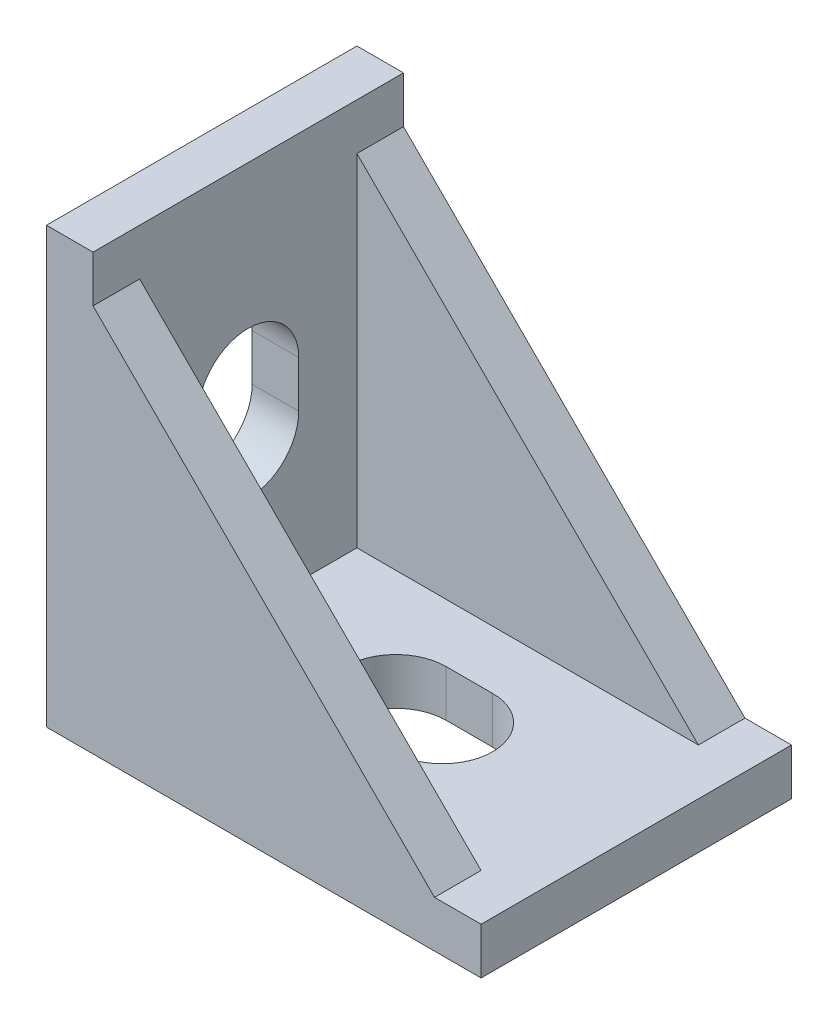
ISO-10303-21;
HEADER;
FILE_DESCRIPTION(('STEP AP214'),'2;1');
FILE_NAME('part.step','',(''),(''),'','','');
FILE_SCHEMA(('AUTOMOTIVE_DESIGN { 1 0 10303 214 1 1 1 1 }'));
ENDSEC;
DATA;
#1=APPLICATION_CONTEXT('core data for automotive mechanical design processes');
#2=APPLICATION_PROTOCOL_DEFINITION('international standard','automotive_design',2000,#1);
#3=PRODUCT_CONTEXT('',#1,'mechanical');
#4=PRODUCT('Part','Part','',(#3));
#5=PRODUCT_RELATED_PRODUCT_CATEGORY('part','',(#4));
#6=PRODUCT_DEFINITION_FORMATION('','',#4);
#7=PRODUCT_DEFINITION_CONTEXT('part definition',#1,'design');
#8=PRODUCT_DEFINITION('design','',#6,#7);
#9=PRODUCT_DEFINITION_SHAPE('','',#8);
#10=(LENGTH_UNIT() NAMED_UNIT(*) SI_UNIT(.MILLI.,.METRE.));
#11=(NAMED_UNIT(*) PLANE_ANGLE_UNIT() SI_UNIT($,.RADIAN.));
#12=(NAMED_UNIT(*) SI_UNIT($,.STERADIAN.) SOLID_ANGLE_UNIT());
#13=UNCERTAINTY_MEASURE_WITH_UNIT(LENGTH_MEASURE(1.E-05),#10,'distance_accuracy_value','');
#14=(GEOMETRIC_REPRESENTATION_CONTEXT(3) GLOBAL_UNCERTAINTY_ASSIGNED_CONTEXT((#13)) GLOBAL_UNIT_ASSIGNED_CONTEXT((#10,
#11,#12)) REPRESENTATION_CONTEXT('',''));
#15=CARTESIAN_POINT('',(0.,0.,0.));
#16=DIRECTION('',(0.,0.,1.));
#17=DIRECTION('',(1.,0.,0.));
#18=AXIS2_PLACEMENT_3D('',#15,#16,#17);
#19=CARTESIAN_POINT('',(3.,28.,20.));
#20=DIRECTION('',(-1.,0.,0.));
#21=DIRECTION('',(0.,-1.,0.));
#22=AXIS2_PLACEMENT_3D('',#19,#20,#21);
#23=PLANE('',#22);
#24=DIRECTION('',(0.,0.,-1.));
#25=VECTOR('',#24,1.);
#26=CARTESIAN_POINT('',(3.,25.,20.));
#27=LINE('',#26,#25);
#28=CARTESIAN_POINT('',(3.,25.,20.));
#29=VERTEX_POINT('',#28);
#30=CARTESIAN_POINT('',(2.99999999999962,25.,17.));
#31=VERTEX_POINT('',#30);
#32=EDGE_CURVE('E378',#29,#31,#27,.T.);
#33=ORIENTED_EDGE('',*,*,#32,.T.);
#34=DIRECTION('',(0.,-1.,0.));
#35=VECTOR('',#34,1.);
#36=CARTESIAN_POINT('',(2.99999999999957,28.0000000000001,17.));
#37=LINE('',#36,#35);
#38=CARTESIAN_POINT('',(3.,3.00000000000005,17.));
#39=VERTEX_POINT('',#38);
#40=EDGE_CURVE('E306',#31,#39,#37,.T.);
#41=ORIENTED_EDGE('',*,*,#40,.T.);
#42=DIRECTION('',(0.,0.,1.));
#43=VECTOR('',#42,1.);
#44=CARTESIAN_POINT('',(3.,3.00000000000005,17.));
#45=LINE('',#44,#43);
#46=CARTESIAN_POINT('',(3.,3.00000000000005,3.));
#47=VERTEX_POINT('',#46);
#48=EDGE_CURVE('E299',#47,#39,#45,.T.);
#49=ORIENTED_EDGE('',*,*,#48,.F.);
#50=DIRECTION('',(0.,-1.,0.));
#51=VECTOR('',#50,1.);
#52=CARTESIAN_POINT('',(2.99999999999957,28.0000000000001,3.));
#53=LINE('',#52,#51);
#54=CARTESIAN_POINT('',(2.99999999999962,25.,3.));
#55=VERTEX_POINT('',#54);
#56=EDGE_CURVE('E309',#55,#47,#53,.T.);
#57=ORIENTED_EDGE('',*,*,#56,.F.);
#58=CARTESIAN_POINT('',(3.,25.,0.));
#59=VERTEX_POINT('',#58);
#60=EDGE_CURVE('E377',#55,#59,#27,.T.);
#61=ORIENTED_EDGE('',*,*,#60,.T.);
#62=DIRECTION('',(0.,1.,0.));
#63=VECTOR('',#62,1.);
#64=CARTESIAN_POINT('',(3.,28.,0.));
#65=LINE('',#64,#63);
#66=CARTESIAN_POINT('',(3.,28.,0.));
#67=VERTEX_POINT('',#66);
#68=EDGE_CURVE('E358',#59,#67,#65,.T.);
#69=ORIENTED_EDGE('',*,*,#68,.T.);
#70=DIRECTION('',(0.,0.,-1.));
#71=VECTOR('',#70,1.);
#72=CARTESIAN_POINT('',(3.,28.,20.));
#73=LINE('',#72,#71);
#74=CARTESIAN_POINT('',(3.,28.,20.));
#75=VERTEX_POINT('',#74);
#76=EDGE_CURVE('E374',#75,#67,#73,.T.);
#77=ORIENTED_EDGE('',*,*,#76,.F.);
#78=DIRECTION('',(0.,1.,0.));
#79=VECTOR('',#78,1.);
#80=CARTESIAN_POINT('',(3.,28.,20.));
#81=LINE('',#80,#79);
#82=EDGE_CURVE('E334',#29,#75,#81,.T.);
#83=ORIENTED_EDGE('',*,*,#82,.F.);
#84=EDGE_LOOP('',(#33,#41,#49,#57,#61,#69,#77,#83));
#85=FACE_BOUND('',#84,.T.);
#86=CARTESIAN_POINT('',(3.,15.5,10.));
#87=DIRECTION('',(-1.,0.,0.));
#88=DIRECTION('',(0.,-1.,0.));
#89=AXIS2_PLACEMENT_3D('',#86,#87,#88);
#90=CIRCLE('',#89,3.25);
#91=CARTESIAN_POINT('',(3.00000000000001,15.5,6.75));
#92=VERTEX_POINT('',#91);
#93=CARTESIAN_POINT('',(3.00000000000001,15.5,13.25));
#94=VERTEX_POINT('',#93);
#95=EDGE_CURVE('E262',#92,#94,#90,.F.);
#96=ORIENTED_EDGE('',*,*,#95,.F.);
#97=DIRECTION('',(0.,-1.,0.));
#98=VECTOR('',#97,1.);
#99=CARTESIAN_POINT('',(3.,28.,6.75));
#100=LINE('',#99,#98);
#101=CARTESIAN_POINT('',(3.,12.5,6.75));
#102=VERTEX_POINT('',#101);
#103=EDGE_CURVE('E251',#92,#102,#100,.T.);
#104=ORIENTED_EDGE('',*,*,#103,.T.);
#105=CARTESIAN_POINT('',(3.,12.5,10.));
#106=DIRECTION('',(-1.,0.,0.));
#107=DIRECTION('',(0.,-1.,0.));
#108=AXIS2_PLACEMENT_3D('',#105,#106,#107);
#109=CIRCLE('',#108,3.25);
#110=CARTESIAN_POINT('',(3.00000000000001,12.5,13.25));
#111=VERTEX_POINT('',#110);
#112=EDGE_CURVE('E225',#102,#111,#109,.T.);
#113=ORIENTED_EDGE('',*,*,#112,.T.);
#114=DIRECTION('',(0.,1.,0.));
#115=VECTOR('',#114,1.);
#116=CARTESIAN_POINT('',(3.,28.,13.25));
#117=LINE('',#116,#115);
#118=EDGE_CURVE('E258',#111,#94,#117,.T.);
#119=ORIENTED_EDGE('',*,*,#118,.T.);
#120=EDGE_LOOP('',(#96,#104,#113,#119));
#121=FACE_BOUND('',#120,.T.);
#122=ADVANCED_FACE('F93',(#85,#121),#23,.F.);
#123=CARTESIAN_POINT('',(0.,0.,20.));
#124=DIRECTION('',(1.,0.,0.));
#125=DIRECTION('',(0.,0.,-1.));
#126=AXIS2_PLACEMENT_3D('',#123,#124,#125);
#127=PLANE('',#126);
#128=DIRECTION('',(0.,-1.,0.));
#129=VECTOR('',#128,1.);
#130=CARTESIAN_POINT('',(0.,0.,0.));
#131=LINE('',#130,#129);
#132=CARTESIAN_POINT('',(0.,28.,0.));
#133=VERTEX_POINT('',#132);
#134=CARTESIAN_POINT('',(0.,0.,0.));
#135=VERTEX_POINT('',#134);
#136=EDGE_CURVE('E325',#133,#135,#131,.T.);
#137=ORIENTED_EDGE('',*,*,#136,.T.);
#138=DIRECTION('',(0.,0.,-1.));
#139=VECTOR('',#138,1.);
#140=CARTESIAN_POINT('',(0.,0.,20.));
#141=LINE('',#140,#139);
#142=CARTESIAN_POINT('',(0.,0.,20.));
#143=VERTEX_POINT('',#142);
#144=EDGE_CURVE('E343',#143,#135,#141,.T.);
#145=ORIENTED_EDGE('',*,*,#144,.F.);
#146=DIRECTION('',(0.,-1.,0.));
#147=VECTOR('',#146,1.);
#148=CARTESIAN_POINT('',(0.,0.,20.));
#149=LINE('',#148,#147);
#150=CARTESIAN_POINT('',(0.,28.,20.));
#151=VERTEX_POINT('',#150);
#152=EDGE_CURVE('E340',#151,#143,#149,.T.);
#153=ORIENTED_EDGE('',*,*,#152,.F.);
#154=DIRECTION('',(0.,0.,-1.));
#155=VECTOR('',#154,1.);
#156=CARTESIAN_POINT('',(0.,28.,20.));
#157=LINE('',#156,#155);
#158=EDGE_CURVE('E370',#151,#133,#157,.T.);
#159=ORIENTED_EDGE('',*,*,#158,.T.);
#160=EDGE_LOOP('',(#137,#145,#153,#159));
#161=FACE_BOUND('',#160,.T.);
#162=CARTESIAN_POINT('',(0.,15.5,10.));
#163=DIRECTION('',(1.,0.,0.));
#164=DIRECTION('',(0.,1.,0.));
#165=AXIS2_PLACEMENT_3D('',#162,#163,#164);
#166=CIRCLE('',#165,3.25);
#167=CARTESIAN_POINT('',(0.,15.5,6.75));
#168=VERTEX_POINT('',#167);
#169=CARTESIAN_POINT('',(0.,15.5,13.25));
#170=VERTEX_POINT('',#169);
#171=EDGE_CURVE('E117',#168,#170,#166,.T.);
#172=ORIENTED_EDGE('',*,*,#171,.T.);
#173=DIRECTION('',(0.,1.,0.));
#174=VECTOR('',#173,1.);
#175=CARTESIAN_POINT('',(0.,0.,13.25));
#176=LINE('',#175,#174);
#177=CARTESIAN_POINT('',(0.,12.5,13.25));
#178=VERTEX_POINT('',#177);
#179=EDGE_CURVE('E239',#178,#170,#176,.T.);
#180=ORIENTED_EDGE('',*,*,#179,.F.);
#181=CARTESIAN_POINT('',(0.,12.5,10.));
#182=DIRECTION('',(1.,0.,0.));
#183=DIRECTION('',(0.,1.,0.));
#184=AXIS2_PLACEMENT_3D('',#181,#182,#183);
#185=CIRCLE('',#184,3.25);
#186=CARTESIAN_POINT('',(0.,12.5,6.75));
#187=VERTEX_POINT('',#186);
#188=EDGE_CURVE('E222',#187,#178,#185,.F.);
#189=ORIENTED_EDGE('',*,*,#188,.F.);
#190=DIRECTION('',(0.,-1.,0.));
#191=VECTOR('',#190,1.);
#192=CARTESIAN_POINT('',(0.,0.,6.75));
#193=LINE('',#192,#191);
#194=EDGE_CURVE('E231',#168,#187,#193,.T.);
#195=ORIENTED_EDGE('',*,*,#194,.F.);
#196=EDGE_LOOP('',(#172,#180,#189,#195));
#197=FACE_BOUND('',#196,.T.);
#198=ADVANCED_FACE('F237',(#161,#197),#127,.F.);
#199=CARTESIAN_POINT('',(25.,3.,20.));
#200=DIRECTION('',(-0.707106781186548,-0.707106781186548,0.));
#201=DIRECTION('',(0.707106781186548,-0.707106781186548,0.));
#202=AXIS2_PLACEMENT_3D('',#199,#200,#201);
#203=PLANE('',#202);
#204=DIRECTION('',(-0.707106781186548,0.707106781186548,0.));
#205=VECTOR('',#204,1.);
#206=CARTESIAN_POINT('',(25.,3.,3.));
#207=LINE('',#206,#205);
#208=CARTESIAN_POINT('',(25.,3.00000000000044,3.));
#209=VERTEX_POINT('',#208);
#210=EDGE_CURVE('E316',#209,#55,#207,.T.);
#211=ORIENTED_EDGE('',*,*,#210,.F.);
#212=DIRECTION('',(0.,0.,-1.));
#213=VECTOR('',#212,1.);
#214=CARTESIAN_POINT('',(25.,3.,20.));
#215=LINE('',#214,#213);
#216=CARTESIAN_POINT('',(25.,3.,0.));
#217=VERTEX_POINT('',#216);
#218=EDGE_CURVE('E382',#209,#217,#215,.T.);
#219=ORIENTED_EDGE('',*,*,#218,.T.);
#220=DIRECTION('',(-0.707106781186548,0.707106781186548,0.));
#221=VECTOR('',#220,1.);
#222=CARTESIAN_POINT('',(25.,3.,0.));
#223=LINE('',#222,#221);
#224=EDGE_CURVE('E354',#217,#59,#223,.T.);
#225=ORIENTED_EDGE('',*,*,#224,.T.);
#226=ORIENTED_EDGE('',*,*,#60,.F.);
#227=EDGE_LOOP('',(#211,#219,#225,#226));
#228=FACE_BOUND('',#227,.T.);
#229=ADVANCED_FACE('F440',(#228),#203,.F.);
#230=DIRECTION('',(0.707106781186548,-0.707106781186548,0.));
#231=VECTOR('',#230,1.);
#232=CARTESIAN_POINT('',(25.,3.,17.));
#233=LINE('',#232,#231);
#234=CARTESIAN_POINT('',(25.,3.,17.));
#235=VERTEX_POINT('',#234);
#236=EDGE_CURVE('E312',#31,#235,#233,.T.);
#237=ORIENTED_EDGE('',*,*,#236,.F.);
#238=ORIENTED_EDGE('',*,*,#32,.F.);
#239=DIRECTION('',(-0.707106781186548,0.707106781186548,0.));
#240=VECTOR('',#239,1.);
#241=CARTESIAN_POINT('',(25.,3.,20.));
#242=LINE('',#241,#240);
#243=CARTESIAN_POINT('',(25.,3.,20.));
#244=VERTEX_POINT('',#243);
#245=EDGE_CURVE('E331',#244,#29,#242,.T.);
#246=ORIENTED_EDGE('',*,*,#245,.F.);
#247=EDGE_CURVE('E383',#244,#235,#215,.T.);
#248=ORIENTED_EDGE('',*,*,#247,.T.);
#249=EDGE_LOOP('',(#237,#238,#246,#248));
#250=FACE_BOUND('',#249,.T.);
#251=ADVANCED_FACE('F449',(#250),#203,.F.);
#252=CARTESIAN_POINT('',(0.,0.,20.));
#253=DIRECTION('',(0.,1.,0.));
#254=DIRECTION('',(-1.,0.,0.));
#255=AXIS2_PLACEMENT_3D('',#252,#253,#254);
#256=PLANE('',#255);
#257=DIRECTION('',(-1.,0.,0.));
#258=VECTOR('',#257,1.);
#259=CARTESIAN_POINT('',(0.,0.,6.75));
#260=LINE('',#259,#258);
#261=CARTESIAN_POINT('',(15.5,0.,6.75));
#262=VERTEX_POINT('',#261);
#263=CARTESIAN_POINT('',(12.5,0.,6.75));
#264=VERTEX_POINT('',#263);
#265=EDGE_CURVE('E277',#262,#264,#260,.T.);
#266=ORIENTED_EDGE('',*,*,#265,.T.);
#267=CARTESIAN_POINT('',(12.5,0.,10.));
#268=DIRECTION('',(0.,-1.,0.));
#269=DIRECTION('',(1.,0.,0.));
#270=AXIS2_PLACEMENT_3D('',#267,#268,#269);
#271=CIRCLE('',#270,3.25);
#272=CARTESIAN_POINT('',(12.5,0.,13.25));
#273=VERTEX_POINT('',#272);
#274=EDGE_CURVE('E273',#264,#273,#271,.F.);
#275=ORIENTED_EDGE('',*,*,#274,.T.);
#276=DIRECTION('',(1.,0.,0.));
#277=VECTOR('',#276,1.);
#278=CARTESIAN_POINT('',(0.,0.,13.25));
#279=LINE('',#278,#277);
#280=CARTESIAN_POINT('',(15.5,0.,13.25));
#281=VERTEX_POINT('',#280);
#282=EDGE_CURVE('E269',#273,#281,#279,.T.);
#283=ORIENTED_EDGE('',*,*,#282,.T.);
#284=CARTESIAN_POINT('',(15.5,0.,10.));
#285=DIRECTION('',(0.,-1.,0.));
#286=DIRECTION('',(1.,0.,0.));
#287=AXIS2_PLACEMENT_3D('',#284,#285,#286);
#288=CIRCLE('',#287,3.25);
#289=EDGE_CURVE('E265',#262,#281,#288,.T.);
#290=ORIENTED_EDGE('',*,*,#289,.F.);
#291=EDGE_LOOP('',(#266,#275,#283,#290));
#292=FACE_BOUND('',#291,.T.);
#293=DIRECTION('',(1.,0.,0.));
#294=VECTOR('',#293,1.);
#295=CARTESIAN_POINT('',(0.,0.,0.));
#296=LINE('',#295,#294);
#297=CARTESIAN_POINT('',(28.,0.,0.));
#298=VERTEX_POINT('',#297);
#299=EDGE_CURVE('E319',#135,#298,#296,.T.);
#300=ORIENTED_EDGE('',*,*,#299,.T.);
#301=DIRECTION('',(0.,0.,-1.));
#302=VECTOR('',#301,1.);
#303=CARTESIAN_POINT('',(28.,0.,20.));
#304=LINE('',#303,#302);
#305=CARTESIAN_POINT('',(28.,0.,20.));
#306=VERTEX_POINT('',#305);
#307=EDGE_CURVE('E391',#306,#298,#304,.T.);
#308=ORIENTED_EDGE('',*,*,#307,.F.);
#309=DIRECTION('',(1.,0.,0.));
#310=VECTOR('',#309,1.);
#311=CARTESIAN_POINT('',(0.,0.,20.));
#312=LINE('',#311,#310);
#313=EDGE_CURVE('E320',#143,#306,#312,.T.);
#314=ORIENTED_EDGE('',*,*,#313,.F.);
#315=ORIENTED_EDGE('',*,*,#144,.T.);
#316=EDGE_LOOP('',(#300,#308,#314,#315));
#317=FACE_BOUND('',#316,.T.);
#318=ADVANCED_FACE('F95',(#292,#317),#256,.F.);
#319=CARTESIAN_POINT('',(28.,0.,20.));
#320=DIRECTION('',(-1.,0.,0.));
#321=DIRECTION('',(0.,0.,1.));
#322=AXIS2_PLACEMENT_3D('',#319,#320,#321);
#323=PLANE('',#322);
#324=DIRECTION('',(0.,1.,0.));
#325=VECTOR('',#324,1.);
#326=CARTESIAN_POINT('',(28.,0.,0.));
#327=LINE('',#326,#325);
#328=CARTESIAN_POINT('',(28.,3.,0.));
#329=VERTEX_POINT('',#328);
#330=EDGE_CURVE('E347',#298,#329,#327,.T.);
#331=ORIENTED_EDGE('',*,*,#330,.T.);
#332=DIRECTION('',(0.,0.,-1.));
#333=VECTOR('',#332,1.);
#334=CARTESIAN_POINT('',(28.,3.,20.));
#335=LINE('',#334,#333);
#336=CARTESIAN_POINT('',(28.,3.,20.));
#337=VERTEX_POINT('',#336);
#338=EDGE_CURVE('E387',#337,#329,#335,.T.);
#339=ORIENTED_EDGE('',*,*,#338,.F.);
#340=DIRECTION('',(0.,1.,0.));
#341=VECTOR('',#340,1.);
#342=CARTESIAN_POINT('',(28.,0.,20.));
#343=LINE('',#342,#341);
#344=EDGE_CURVE('E324',#306,#337,#343,.T.);
#345=ORIENTED_EDGE('',*,*,#344,.F.);
#346=ORIENTED_EDGE('',*,*,#307,.T.);
#347=EDGE_LOOP('',(#331,#339,#345,#346));
#348=FACE_BOUND('',#347,.T.);
#349=ADVANCED_FACE('F452',(#348),#323,.F.);
#350=CARTESIAN_POINT('',(28.,3.,20.));
#351=DIRECTION('',(0.,-1.,0.));
#352=DIRECTION('',(0.,0.,-1.));
#353=AXIS2_PLACEMENT_3D('',#350,#351,#352);
#354=PLANE('',#353);
#355=DIRECTION('',(-1.,0.,0.));
#356=VECTOR('',#355,1.);
#357=CARTESIAN_POINT('',(28.,3.,6.75));
#358=LINE('',#357,#356);
#359=CARTESIAN_POINT('',(15.5,3.,6.75));
#360=VERTEX_POINT('',#359);
#361=CARTESIAN_POINT('',(12.5,3.,6.75));
#362=VERTEX_POINT('',#361);
#363=EDGE_CURVE('E12',#360,#362,#358,.T.);
#364=ORIENTED_EDGE('',*,*,#363,.F.);
#365=CARTESIAN_POINT('',(15.5,3.,10.));
#366=DIRECTION('',(0.,-1.,0.));
#367=DIRECTION('',(0.,0.,-1.));
#368=AXIS2_PLACEMENT_3D('',#365,#366,#367);
#369=CIRCLE('',#368,3.25);
#370=CARTESIAN_POINT('',(15.5,3.,13.25));
#371=VERTEX_POINT('',#370);
#372=EDGE_CURVE('E102',#360,#371,#369,.T.);
#373=ORIENTED_EDGE('',*,*,#372,.T.);
#374=DIRECTION('',(1.,0.,0.));
#375=VECTOR('',#374,1.);
#376=CARTESIAN_POINT('',(28.,3.,13.25));
#377=LINE('',#376,#375);
#378=CARTESIAN_POINT('',(12.5,3.,13.25));
#379=VERTEX_POINT('',#378);
#380=EDGE_CURVE('E398',#379,#371,#377,.T.);
#381=ORIENTED_EDGE('',*,*,#380,.F.);
#382=CARTESIAN_POINT('',(12.5,3.,10.));
#383=DIRECTION('',(0.,-1.,0.));
#384=DIRECTION('',(0.,0.,-1.));
#385=AXIS2_PLACEMENT_3D('',#382,#383,#384);
#386=CIRCLE('',#385,3.25);
#387=EDGE_CURVE('E395',#362,#379,#386,.F.);
#388=ORIENTED_EDGE('',*,*,#387,.F.);
#389=EDGE_LOOP('',(#364,#373,#381,#388));
#390=FACE_BOUND('',#389,.T.);
#391=DIRECTION('',(-1.,0.,0.));
#392=VECTOR('',#391,1.);
#393=CARTESIAN_POINT('',(28.,3.,0.));
#394=LINE('',#393,#392);
#395=EDGE_CURVE('E350',#329,#217,#394,.T.);
#396=ORIENTED_EDGE('',*,*,#395,.T.);
#397=ORIENTED_EDGE('',*,*,#218,.F.);
#398=DIRECTION('',(-1.,0.,0.));
#399=VECTOR('',#398,1.);
#400=CARTESIAN_POINT('',(3.,3.00000000000005,3.));
#401=LINE('',#400,#399);
#402=EDGE_CURVE('E295',#209,#47,#401,.T.);
#403=ORIENTED_EDGE('',*,*,#402,.T.);
#404=ORIENTED_EDGE('',*,*,#48,.T.);
#405=DIRECTION('',(1.,0.,0.));
#406=VECTOR('',#405,1.);
#407=CARTESIAN_POINT('',(25.,3.00000000000044,17.));
#408=LINE('',#407,#406);
#409=EDGE_CURVE('E303',#39,#235,#408,.T.);
#410=ORIENTED_EDGE('',*,*,#409,.T.);
#411=ORIENTED_EDGE('',*,*,#247,.F.);
#412=DIRECTION('',(-1.,0.,0.));
#413=VECTOR('',#412,1.);
#414=CARTESIAN_POINT('',(28.,3.,20.));
#415=LINE('',#414,#413);
#416=EDGE_CURVE('E328',#337,#244,#415,.T.);
#417=ORIENTED_EDGE('',*,*,#416,.F.);
#418=ORIENTED_EDGE('',*,*,#338,.T.);
#419=EDGE_LOOP('',(#396,#397,#403,#404,#410,#411,#417,#418));
#420=FACE_BOUND('',#419,.T.);
#421=ADVANCED_FACE('F405',(#390,#420),#354,.F.);
#422=CARTESIAN_POINT('',(0.,28.,20.));
#423=DIRECTION('',(0.,-1.,0.));
#424=DIRECTION('',(0.,0.,-1.));
#425=AXIS2_PLACEMENT_3D('',#422,#423,#424);
#426=PLANE('',#425);
#427=DIRECTION('',(-1.,0.,0.));
#428=VECTOR('',#427,1.);
#429=CARTESIAN_POINT('',(0.,28.,0.));
#430=LINE('',#429,#428);
#431=EDGE_CURVE('E362',#67,#133,#430,.T.);
#432=ORIENTED_EDGE('',*,*,#431,.T.);
#433=ORIENTED_EDGE('',*,*,#158,.F.);
#434=DIRECTION('',(-1.,0.,0.));
#435=VECTOR('',#434,1.);
#436=CARTESIAN_POINT('',(0.,28.,20.));
#437=LINE('',#436,#435);
#438=EDGE_CURVE('E337',#75,#151,#437,.T.);
#439=ORIENTED_EDGE('',*,*,#438,.F.);
#440=ORIENTED_EDGE('',*,*,#76,.T.);
#441=EDGE_LOOP('',(#432,#433,#439,#440));
#442=FACE_BOUND('',#441,.T.);
#443=ADVANCED_FACE('F446',(#442),#426,.F.);
#444=CARTESIAN_POINT('',(0.,0.,20.));
#445=DIRECTION('',(0.,0.,1.));
#446=DIRECTION('',(1.,0.,0.));
#447=AXIS2_PLACEMENT_3D('',#444,#445,#446);
#448=PLANE('',#447);
#449=ORIENTED_EDGE('',*,*,#313,.T.);
#450=ORIENTED_EDGE('',*,*,#344,.T.);
#451=ORIENTED_EDGE('',*,*,#416,.T.);
#452=ORIENTED_EDGE('',*,*,#245,.T.);
#453=ORIENTED_EDGE('',*,*,#82,.T.);
#454=ORIENTED_EDGE('',*,*,#438,.T.);
#455=ORIENTED_EDGE('',*,*,#152,.T.);
#456=EDGE_LOOP('',(#449,#450,#451,#452,#453,#454,#455));
#457=FACE_BOUND('',#456,.T.);
#458=ADVANCED_FACE('F488',(#457),#448,.T.);
#459=CARTESIAN_POINT('',(0.,0.,0.));
#460=DIRECTION('',(0.,0.,1.));
#461=DIRECTION('',(1.,0.,0.));
#462=AXIS2_PLACEMENT_3D('',#459,#460,#461);
#463=PLANE('',#462);
#464=ORIENTED_EDGE('',*,*,#299,.F.);
#465=ORIENTED_EDGE('',*,*,#136,.F.);
#466=ORIENTED_EDGE('',*,*,#431,.F.);
#467=ORIENTED_EDGE('',*,*,#68,.F.);
#468=ORIENTED_EDGE('',*,*,#224,.F.);
#469=ORIENTED_EDGE('',*,*,#395,.F.);
#470=ORIENTED_EDGE('',*,*,#330,.F.);
#471=EDGE_LOOP('',(#464,#465,#466,#467,#468,#469,#470));
#472=FACE_BOUND('',#471,.T.);
#473=ADVANCED_FACE('F467',(#472),#463,.F.);
#474=CARTESIAN_POINT('',(2.99999999999957,28.0000000000001,3.));
#475=DIRECTION('',(0.,0.,1.));
#476=DIRECTION('',(1.,0.,0.));
#477=AXIS2_PLACEMENT_3D('',#474,#475,#476);
#478=PLANE('',#477);
#479=ORIENTED_EDGE('',*,*,#210,.T.);
#480=ORIENTED_EDGE('',*,*,#56,.T.);
#481=ORIENTED_EDGE('',*,*,#402,.F.);
#482=EDGE_LOOP('',(#479,#480,#481));
#483=FACE_BOUND('',#482,.T.);
#484=ADVANCED_FACE('F478',(#483),#478,.T.);
#485=CARTESIAN_POINT('',(24.9999999999996,28.0000000000004,17.));
#486=DIRECTION('',(0.,0.,-1.));
#487=DIRECTION('',(-1.,0.,0.));
#488=AXIS2_PLACEMENT_3D('',#485,#486,#487);
#489=PLANE('',#488);
#490=ORIENTED_EDGE('',*,*,#236,.T.);
#491=ORIENTED_EDGE('',*,*,#409,.F.);
#492=ORIENTED_EDGE('',*,*,#40,.F.);
#493=EDGE_LOOP('',(#490,#491,#492));
#494=FACE_BOUND('',#493,.T.);
#495=ADVANCED_FACE('F481',(#494),#489,.T.);
#496=CARTESIAN_POINT('',(0.,28.,6.75));
#497=DIRECTION('',(0.,0.,1.));
#498=DIRECTION('',(1.,0.,0.));
#499=AXIS2_PLACEMENT_3D('',#496,#497,#498);
#500=PLANE('',#499);
#501=ORIENTED_EDGE('',*,*,#363,.T.);
#502=DIRECTION('',(0.,-1.,0.));
#503=VECTOR('',#502,1.);
#504=CARTESIAN_POINT('',(12.4999999999999,28.,6.75));
#505=LINE('',#504,#503);
#506=EDGE_CURVE('E282',#362,#264,#505,.T.);
#507=ORIENTED_EDGE('',*,*,#506,.T.);
#508=ORIENTED_EDGE('',*,*,#265,.F.);
#509=DIRECTION('',(0.,-1.,0.));
#510=VECTOR('',#509,1.);
#511=CARTESIAN_POINT('',(15.4999999999999,28.0000000000001,6.75));
#512=LINE('',#511,#510);
#513=EDGE_CURVE('E285',#262,#360,#512,.F.);
#514=ORIENTED_EDGE('',*,*,#513,.T.);
#515=EDGE_LOOP('',(#501,#507,#508,#514));
#516=FACE_BOUND('',#515,.T.);
#517=ADVANCED_FACE('F414',(#516),#500,.T.);
#518=CARTESIAN_POINT('',(15.4999999999999,28.0000000000001,10.));
#519=DIRECTION('',(0.,-1.,0.));
#520=DIRECTION('',(1.,0.,0.));
#521=AXIS2_PLACEMENT_3D('',#518,#519,#520);
#522=CYLINDRICAL_SURFACE('',#521,3.25);
#523=ORIENTED_EDGE('',*,*,#513,.F.);
#524=ORIENTED_EDGE('',*,*,#289,.T.);
#525=DIRECTION('',(0.,-1.,0.));
#526=VECTOR('',#525,1.);
#527=CARTESIAN_POINT('',(15.4999999999999,28.0000000000001,13.25));
#528=LINE('',#527,#526);
#529=EDGE_CURVE('E281',#371,#281,#528,.T.);
#530=ORIENTED_EDGE('',*,*,#529,.F.);
#531=ORIENTED_EDGE('',*,*,#372,.F.);
#532=EDGE_LOOP('',(#523,#524,#530,#531));
#533=FACE_BOUND('',#532,.T.);
#534=ADVANCED_FACE('F411',(#533),#522,.F.);
#535=CARTESIAN_POINT('',(0.,28.,13.25));
#536=DIRECTION('',(0.,0.,-1.));
#537=DIRECTION('',(-1.,0.,0.));
#538=AXIS2_PLACEMENT_3D('',#535,#536,#537);
#539=PLANE('',#538);
#540=ORIENTED_EDGE('',*,*,#380,.T.);
#541=ORIENTED_EDGE('',*,*,#529,.T.);
#542=ORIENTED_EDGE('',*,*,#282,.F.);
#543=DIRECTION('',(0.,-1.,0.));
#544=VECTOR('',#543,1.);
#545=CARTESIAN_POINT('',(12.4999999999999,28.,13.25));
#546=LINE('',#545,#544);
#547=EDGE_CURVE('E286',#379,#273,#546,.T.);
#548=ORIENTED_EDGE('',*,*,#547,.F.);
#549=EDGE_LOOP('',(#540,#541,#542,#548));
#550=FACE_BOUND('',#549,.T.);
#551=ADVANCED_FACE('F420',(#550),#539,.T.);
#552=CARTESIAN_POINT('',(12.4999999999999,28.,10.));
#553=DIRECTION('',(0.,-1.,0.));
#554=DIRECTION('',(1.,0.,0.));
#555=AXIS2_PLACEMENT_3D('',#552,#553,#554);
#556=CYLINDRICAL_SURFACE('',#555,3.25);
#557=ORIENTED_EDGE('',*,*,#387,.T.);
#558=ORIENTED_EDGE('',*,*,#547,.T.);
#559=ORIENTED_EDGE('',*,*,#274,.F.);
#560=ORIENTED_EDGE('',*,*,#506,.F.);
#561=EDGE_LOOP('',(#557,#558,#559,#560));
#562=FACE_BOUND('',#561,.T.);
#563=ADVANCED_FACE('F422',(#562),#556,.F.);
#564=CARTESIAN_POINT('',(28.,15.5,10.));
#565=DIRECTION('',(-1.,0.,0.));
#566=DIRECTION('',(0.,-1.,0.));
#567=AXIS2_PLACEMENT_3D('',#564,#565,#566);
#568=CYLINDRICAL_SURFACE('',#567,3.25);
#569=ORIENTED_EDGE('',*,*,#95,.T.);
#570=DIRECTION('',(-1.,0.,0.));
#571=VECTOR('',#570,1.);
#572=CARTESIAN_POINT('',(28.,15.5,13.25));
#573=LINE('',#572,#571);
#574=EDGE_CURVE('E248',#94,#170,#573,.T.);
#575=ORIENTED_EDGE('',*,*,#574,.T.);
#576=ORIENTED_EDGE('',*,*,#171,.F.);
#577=DIRECTION('',(-1.,0.,0.));
#578=VECTOR('',#577,1.);
#579=CARTESIAN_POINT('',(28.,15.5,6.75));
#580=LINE('',#579,#578);
#581=EDGE_CURVE('E233',#92,#168,#580,.T.);
#582=ORIENTED_EDGE('',*,*,#581,.F.);
#583=EDGE_LOOP('',(#569,#575,#576,#582));
#584=FACE_BOUND('',#583,.T.);
#585=ADVANCED_FACE('F424',(#584),#568,.F.);
#586=CARTESIAN_POINT('',(28.,0.,13.25));
#587=DIRECTION('',(0.,0.,1.));
#588=DIRECTION('',(1.,0.,0.));
#589=AXIS2_PLACEMENT_3D('',#586,#587,#588);
#590=PLANE('',#589);
#591=DIRECTION('',(-1.,0.,0.));
#592=VECTOR('',#591,1.);
#593=CARTESIAN_POINT('',(28.,12.5,13.25));
#594=LINE('',#593,#592);
#595=EDGE_CURVE('E228',#111,#178,#594,.T.);
#596=ORIENTED_EDGE('',*,*,#595,.T.);
#597=ORIENTED_EDGE('',*,*,#179,.T.);
#598=ORIENTED_EDGE('',*,*,#574,.F.);
#599=ORIENTED_EDGE('',*,*,#118,.F.);
#600=EDGE_LOOP('',(#596,#597,#598,#599));
#601=FACE_BOUND('',#600,.T.);
#602=ADVANCED_FACE('F430',(#601),#590,.F.);
#603=CARTESIAN_POINT('',(28.,12.5,10.));
#604=DIRECTION('',(-1.,0.,0.));
#605=DIRECTION('',(0.,-1.,0.));
#606=AXIS2_PLACEMENT_3D('',#603,#604,#605);
#607=CYLINDRICAL_SURFACE('',#606,3.25);
#608=DIRECTION('',(-1.,0.,0.));
#609=VECTOR('',#608,1.);
#610=CARTESIAN_POINT('',(28.,12.5,6.75));
#611=LINE('',#610,#609);
#612=EDGE_CURVE('E109',#102,#187,#611,.T.);
#613=ORIENTED_EDGE('',*,*,#612,.T.);
#614=ORIENTED_EDGE('',*,*,#188,.T.);
#615=ORIENTED_EDGE('',*,*,#595,.F.);
#616=ORIENTED_EDGE('',*,*,#112,.F.);
#617=EDGE_LOOP('',(#613,#614,#615,#616));
#618=FACE_BOUND('',#617,.T.);
#619=ADVANCED_FACE('F219',(#618),#607,.F.);
#620=CARTESIAN_POINT('',(28.,0.,6.75));
#621=DIRECTION('',(0.,0.,-1.));
#622=DIRECTION('',(-1.,0.,0.));
#623=AXIS2_PLACEMENT_3D('',#620,#621,#622);
#624=PLANE('',#623);
#625=ORIENTED_EDGE('',*,*,#581,.T.);
#626=ORIENTED_EDGE('',*,*,#194,.T.);
#627=ORIENTED_EDGE('',*,*,#612,.F.);
#628=ORIENTED_EDGE('',*,*,#103,.F.);
#629=EDGE_LOOP('',(#625,#626,#627,#628));
#630=FACE_BOUND('',#629,.T.);
#631=ADVANCED_FACE('F232',(#630),#624,.F.);
#632=CLOSED_SHELL('',(#122,#198,#229,#251,#318,#349,#421,#443,#458,#473,#484,#495,#517,#534,
#551,#563,#585,#602,#619,#631));
#633=MANIFOLD_SOLID_BREP('B2',#632);
#634=ADVANCED_BREP_SHAPE_REPRESENTATION('',(#18,#633),#14);
#635=SHAPE_DEFINITION_REPRESENTATION(#9,#634);
ENDSEC;
END-ISO-10303-21;
